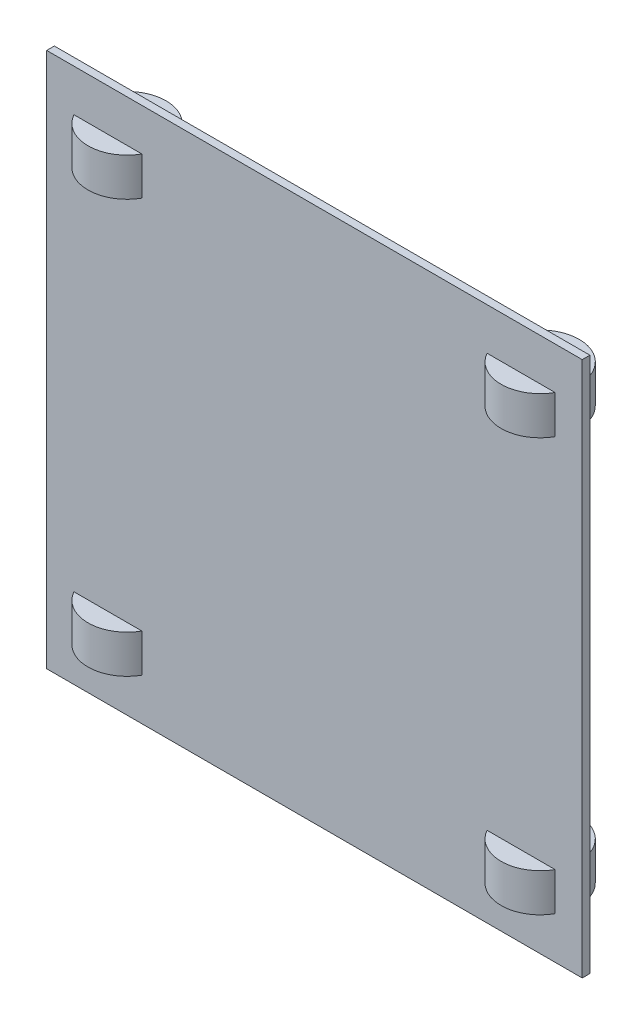
ISO-10303-21;
HEADER;
FILE_DESCRIPTION(('STEP AP214'),'2;1');
FILE_NAME('part.step','',(''),(''),'','','');
FILE_SCHEMA(('AUTOMOTIVE_DESIGN { 1 0 10303 214 1 1 1 1 }'));
ENDSEC;
DATA;
#1=APPLICATION_CONTEXT('core data for automotive mechanical design processes');
#2=APPLICATION_PROTOCOL_DEFINITION('international standard','automotive_design',2000,#1);
#3=PRODUCT_CONTEXT('',#1,'mechanical');
#4=PRODUCT('Part','Part','',(#3));
#5=PRODUCT_RELATED_PRODUCT_CATEGORY('part','',(#4));
#6=PRODUCT_DEFINITION_FORMATION('','',#4);
#7=PRODUCT_DEFINITION_CONTEXT('part definition',#1,'design');
#8=PRODUCT_DEFINITION('design','',#6,#7);
#9=PRODUCT_DEFINITION_SHAPE('','',#8);
#10=(LENGTH_UNIT() NAMED_UNIT(*) SI_UNIT(.MILLI.,.METRE.));
#11=(NAMED_UNIT(*) PLANE_ANGLE_UNIT() SI_UNIT($,.RADIAN.));
#12=(NAMED_UNIT(*) SI_UNIT($,.STERADIAN.) SOLID_ANGLE_UNIT());
#13=UNCERTAINTY_MEASURE_WITH_UNIT(LENGTH_MEASURE(1.E-05),#10,'distance_accuracy_value','');
#14=(GEOMETRIC_REPRESENTATION_CONTEXT(3) GLOBAL_UNCERTAINTY_ASSIGNED_CONTEXT((#13)) GLOBAL_UNIT_ASSIGNED_CONTEXT((#10,
#11,#12)) REPRESENTATION_CONTEXT('',''));
#15=CARTESIAN_POINT('',(0.,0.,0.));
#16=DIRECTION('',(0.,0.,1.));
#17=DIRECTION('',(1.,0.,0.));
#18=AXIS2_PLACEMENT_3D('',#15,#16,#17);
#19=CARTESIAN_POINT('',(0.,0.,10.));
#20=DIRECTION('',(0.,0.,-1.));
#21=DIRECTION('',(-1.,0.,0.));
#22=AXIS2_PLACEMENT_3D('',#19,#20,#21);
#23=PLANE('',#22);
#24=DIRECTION('',(-1.,0.,0.));
#25=VECTOR('',#24,1.);
#26=CARTESIAN_POINT('',(0.,295.,10.));
#27=LINE('',#26,#25);
#28=CARTESIAN_POINT('',(314.452221541786,295.,10.));
#29=VERTEX_POINT('',#28);
#30=CARTESIAN_POINT('',(225.547778458214,295.,10.));
#31=VERTEX_POINT('',#30);
#32=EDGE_CURVE('E220',#29,#31,#27,.T.);
#33=ORIENTED_EDGE('',*,*,#32,.F.);
#34=DIRECTION('',(0.,-1.,0.));
#35=VECTOR('',#34,1.);
#36=CARTESIAN_POINT('',(314.452221541786,295.,10.));
#37=LINE('',#36,#35);
#38=CARTESIAN_POINT('',(314.452221541786,245.,10.));
#39=VERTEX_POINT('',#38);
#40=EDGE_CURVE('E225',#39,#29,#37,.F.);
#41=ORIENTED_EDGE('',*,*,#40,.F.);
#42=DIRECTION('',(-1.,0.,0.));
#43=VECTOR('',#42,1.);
#44=CARTESIAN_POINT('',(0.,245.,10.));
#45=LINE('',#44,#43);
#46=CARTESIAN_POINT('',(225.547778458214,245.,10.));
#47=VERTEX_POINT('',#46);
#48=EDGE_CURVE('E217',#39,#47,#45,.T.);
#49=ORIENTED_EDGE('',*,*,#48,.T.);
#50=DIRECTION('',(0.,-1.,0.));
#51=VECTOR('',#50,1.);
#52=CARTESIAN_POINT('',(225.547778458214,295.,10.));
#53=LINE('',#52,#51);
#54=EDGE_CURVE('E222',#31,#47,#53,.T.);
#55=ORIENTED_EDGE('',*,*,#54,.F.);
#56=EDGE_LOOP('',(#33,#41,#49,#55));
#57=FACE_BOUND('',#56,.T.);
#58=DIRECTION('',(0.,-1.,0.));
#59=VECTOR('',#58,1.);
#60=CARTESIAN_POINT('',(-314.452221541786,295.,10.));
#61=LINE('',#60,#59);
#62=CARTESIAN_POINT('',(-314.452221541786,295.,10.));
#63=VERTEX_POINT('',#62);
#64=CARTESIAN_POINT('',(-314.452221541786,245.,10.));
#65=VERTEX_POINT('',#64);
#66=EDGE_CURVE('E240',#63,#65,#61,.T.);
#67=ORIENTED_EDGE('',*,*,#66,.F.);
#68=DIRECTION('',(1.,0.,0.));
#69=VECTOR('',#68,1.);
#70=CARTESIAN_POINT('',(0.,295.,10.));
#71=LINE('',#70,#69);
#72=CARTESIAN_POINT('',(-225.547778458214,295.,10.));
#73=VERTEX_POINT('',#72);
#74=EDGE_CURVE('E238',#63,#73,#71,.T.);
#75=ORIENTED_EDGE('',*,*,#74,.T.);
#76=DIRECTION('',(0.,-1.,0.));
#77=VECTOR('',#76,1.);
#78=CARTESIAN_POINT('',(-225.547778458214,295.,10.));
#79=LINE('',#78,#77);
#80=CARTESIAN_POINT('',(-225.547778458214,245.,10.));
#81=VERTEX_POINT('',#80);
#82=EDGE_CURVE('E243',#81,#73,#79,.F.);
#83=ORIENTED_EDGE('',*,*,#82,.F.);
#84=DIRECTION('',(1.,0.,0.));
#85=VECTOR('',#84,1.);
#86=CARTESIAN_POINT('',(0.,245.,10.));
#87=LINE('',#86,#85);
#88=EDGE_CURVE('E235',#65,#81,#87,.T.);
#89=ORIENTED_EDGE('',*,*,#88,.F.);
#90=EDGE_LOOP('',(#67,#75,#83,#89));
#91=FACE_BOUND('',#90,.T.);
#92=DIRECTION('',(0.,1.,0.));
#93=VECTOR('',#92,1.);
#94=CARTESIAN_POINT('',(350.,-350.,10.));
#95=LINE('',#94,#93);
#96=CARTESIAN_POINT('',(350.,-350.,10.));
#97=VERTEX_POINT('',#96);
#98=CARTESIAN_POINT('',(350.,350.,10.));
#99=VERTEX_POINT('',#98);
#100=EDGE_CURVE('E247',#97,#99,#95,.T.);
#101=ORIENTED_EDGE('',*,*,#100,.T.);
#102=DIRECTION('',(-1.,0.,0.));
#103=VECTOR('',#102,1.);
#104=CARTESIAN_POINT('',(-350.,350.,10.));
#105=LINE('',#104,#103);
#106=CARTESIAN_POINT('',(-350.,350.,10.));
#107=VERTEX_POINT('',#106);
#108=EDGE_CURVE('E250',#99,#107,#105,.T.);
#109=ORIENTED_EDGE('',*,*,#108,.T.);
#110=DIRECTION('',(0.,-1.,0.));
#111=VECTOR('',#110,1.);
#112=CARTESIAN_POINT('',(-350.,-350.,10.));
#113=LINE('',#112,#111);
#114=CARTESIAN_POINT('',(-350.,-350.,10.));
#115=VERTEX_POINT('',#114);
#116=EDGE_CURVE('E253',#107,#115,#113,.T.);
#117=ORIENTED_EDGE('',*,*,#116,.T.);
#118=DIRECTION('',(1.,0.,0.));
#119=VECTOR('',#118,1.);
#120=CARTESIAN_POINT('',(-350.,-350.,10.));
#121=LINE('',#120,#119);
#122=EDGE_CURVE('E255',#115,#97,#121,.T.);
#123=ORIENTED_EDGE('',*,*,#122,.T.);
#124=EDGE_LOOP('',(#101,#109,#117,#123));
#125=FACE_BOUND('',#124,.T.);
#126=DIRECTION('',(0.,1.,0.));
#127=VECTOR('',#126,1.);
#128=CARTESIAN_POINT('',(-225.547778458214,-295.,10.));
#129=LINE('',#128,#127);
#130=CARTESIAN_POINT('',(-225.547778458214,-245.,10.));
#131=VERTEX_POINT('',#130);
#132=CARTESIAN_POINT('',(-225.547778458214,-295.,10.));
#133=VERTEX_POINT('',#132);
#134=EDGE_CURVE('E205',#131,#133,#129,.F.);
#135=ORIENTED_EDGE('',*,*,#134,.T.);
#136=DIRECTION('',(-1.,0.,0.));
#137=VECTOR('',#136,1.);
#138=CARTESIAN_POINT('',(0.,-295.,10.));
#139=LINE('',#138,#137);
#140=CARTESIAN_POINT('',(-314.452221541786,-295.,10.));
#141=VERTEX_POINT('',#140);
#142=EDGE_CURVE('E203',#133,#141,#139,.T.);
#143=ORIENTED_EDGE('',*,*,#142,.T.);
#144=DIRECTION('',(0.,1.,0.));
#145=VECTOR('',#144,1.);
#146=CARTESIAN_POINT('',(-314.452221541786,-295.,10.));
#147=LINE('',#146,#145);
#148=CARTESIAN_POINT('',(-314.452221541786,-245.,10.));
#149=VERTEX_POINT('',#148);
#150=EDGE_CURVE('E207',#141,#149,#147,.T.);
#151=ORIENTED_EDGE('',*,*,#150,.T.);
#152=DIRECTION('',(-1.,0.,0.));
#153=VECTOR('',#152,1.);
#154=CARTESIAN_POINT('',(0.,-245.,10.));
#155=LINE('',#154,#153);
#156=EDGE_CURVE('E200',#131,#149,#155,.T.);
#157=ORIENTED_EDGE('',*,*,#156,.F.);
#158=EDGE_LOOP('',(#135,#143,#151,#157));
#159=FACE_BOUND('',#158,.T.);
#160=DIRECTION('',(1.,0.,0.));
#161=VECTOR('',#160,1.);
#162=CARTESIAN_POINT('',(0.,-295.,10.));
#163=LINE('',#162,#161);
#164=CARTESIAN_POINT('',(225.547778458214,-295.,10.));
#165=VERTEX_POINT('',#164);
#166=CARTESIAN_POINT('',(314.452221541786,-295.,10.));
#167=VERTEX_POINT('',#166);
#168=EDGE_CURVE('E175',#165,#167,#163,.T.);
#169=ORIENTED_EDGE('',*,*,#168,.F.);
#170=DIRECTION('',(0.,1.,0.));
#171=VECTOR('',#170,1.);
#172=CARTESIAN_POINT('',(225.547778458214,-295.,10.));
#173=LINE('',#172,#171);
#174=CARTESIAN_POINT('',(225.547778458214,-245.,10.));
#175=VERTEX_POINT('',#174);
#176=EDGE_CURVE('E181',#165,#175,#173,.T.);
#177=ORIENTED_EDGE('',*,*,#176,.T.);
#178=DIRECTION('',(1.,0.,0.));
#179=VECTOR('',#178,1.);
#180=CARTESIAN_POINT('',(0.,-245.,10.));
#181=LINE('',#180,#179);
#182=CARTESIAN_POINT('',(314.452221541786,-245.,10.));
#183=VERTEX_POINT('',#182);
#184=EDGE_CURVE('E170',#175,#183,#181,.T.);
#185=ORIENTED_EDGE('',*,*,#184,.T.);
#186=DIRECTION('',(0.,1.,0.));
#187=VECTOR('',#186,1.);
#188=CARTESIAN_POINT('',(314.452221541786,-295.,10.));
#189=LINE('',#188,#187);
#190=EDGE_CURVE('E183',#183,#167,#189,.F.);
#191=ORIENTED_EDGE('',*,*,#190,.T.);
#192=EDGE_LOOP('',(#169,#177,#185,#191));
#193=FACE_BOUND('',#192,.T.);
#194=ADVANCED_FACE('F37',(#57,#91,#125,#159,#193),#23,.F.);
#195=CARTESIAN_POINT('',(0.,0.,0.));
#196=DIRECTION('',(0.,0.,-1.));
#197=DIRECTION('',(-1.,0.,0.));
#198=AXIS2_PLACEMENT_3D('',#195,#196,#197);
#199=PLANE('',#198);
#200=DIRECTION('',(-1.,0.,0.));
#201=VECTOR('',#200,1.);
#202=CARTESIAN_POINT('',(0.,-295.,0.));
#203=LINE('',#202,#201);
#204=CARTESIAN_POINT('',(-221.255769572184,-295.,0.));
#205=VERTEX_POINT('',#204);
#206=CARTESIAN_POINT('',(-318.744230427816,-295.,0.));
#207=VERTEX_POINT('',#206);
#208=EDGE_CURVE('E304',#205,#207,#203,.T.);
#209=ORIENTED_EDGE('',*,*,#208,.F.);
#210=DIRECTION('',(0.,1.,0.));
#211=VECTOR('',#210,1.);
#212=CARTESIAN_POINT('',(-221.255769572184,-295.,0.));
#213=LINE('',#212,#211);
#214=CARTESIAN_POINT('',(-221.255769572184,-245.,0.));
#215=VERTEX_POINT('',#214);
#216=EDGE_CURVE('E299',#215,#205,#213,.F.);
#217=ORIENTED_EDGE('',*,*,#216,.F.);
#218=DIRECTION('',(-1.,0.,0.));
#219=VECTOR('',#218,1.);
#220=CARTESIAN_POINT('',(0.,-245.,0.));
#221=LINE('',#220,#219);
#222=CARTESIAN_POINT('',(-318.744230427816,-245.,0.));
#223=VERTEX_POINT('',#222);
#224=EDGE_CURVE('E296',#215,#223,#221,.T.);
#225=ORIENTED_EDGE('',*,*,#224,.T.);
#226=DIRECTION('',(0.,1.,0.));
#227=VECTOR('',#226,1.);
#228=CARTESIAN_POINT('',(-318.744230427816,-295.,0.));
#229=LINE('',#228,#227);
#230=EDGE_CURVE('E301',#207,#223,#229,.T.);
#231=ORIENTED_EDGE('',*,*,#230,.F.);
#232=EDGE_LOOP('',(#209,#217,#225,#231));
#233=FACE_BOUND('',#232,.T.);
#234=DIRECTION('',(1.,0.,0.));
#235=VECTOR('',#234,1.);
#236=CARTESIAN_POINT('',(0.,295.,0.));
#237=LINE('',#236,#235);
#238=CARTESIAN_POINT('',(-318.744230427816,295.,0.));
#239=VERTEX_POINT('',#238);
#240=CARTESIAN_POINT('',(-221.255769572184,295.,0.));
#241=VERTEX_POINT('',#240);
#242=EDGE_CURVE('E285',#239,#241,#237,.T.);
#243=ORIENTED_EDGE('',*,*,#242,.F.);
#244=DIRECTION('',(0.,-1.,0.));
#245=VECTOR('',#244,1.);
#246=CARTESIAN_POINT('',(-318.744230427816,295.,0.));
#247=LINE('',#246,#245);
#248=CARTESIAN_POINT('',(-318.744230427816,245.,0.));
#249=VERTEX_POINT('',#248);
#250=EDGE_CURVE('E279',#239,#249,#247,.T.);
#251=ORIENTED_EDGE('',*,*,#250,.T.);
#252=DIRECTION('',(1.,0.,0.));
#253=VECTOR('',#252,1.);
#254=CARTESIAN_POINT('',(0.,245.,0.));
#255=LINE('',#254,#253);
#256=CARTESIAN_POINT('',(-221.255769572184,245.,0.));
#257=VERTEX_POINT('',#256);
#258=EDGE_CURVE('E276',#249,#257,#255,.T.);
#259=ORIENTED_EDGE('',*,*,#258,.T.);
#260=DIRECTION('',(0.,-1.,0.));
#261=VECTOR('',#260,1.);
#262=CARTESIAN_POINT('',(-221.255769572184,295.,0.));
#263=LINE('',#262,#261);
#264=EDGE_CURVE('E282',#257,#241,#263,.F.);
#265=ORIENTED_EDGE('',*,*,#264,.T.);
#266=EDGE_LOOP('',(#243,#251,#259,#265));
#267=FACE_BOUND('',#266,.T.);
#268=DIRECTION('',(0.,1.,0.));
#269=VECTOR('',#268,1.);
#270=CARTESIAN_POINT('',(350.,-350.,0.));
#271=LINE('',#270,#269);
#272=CARTESIAN_POINT('',(350.,-350.,0.));
#273=VERTEX_POINT('',#272);
#274=CARTESIAN_POINT('',(350.,350.,0.));
#275=VERTEX_POINT('',#274);
#276=EDGE_CURVE('E246',#273,#275,#271,.T.);
#277=ORIENTED_EDGE('',*,*,#276,.F.);
#278=DIRECTION('',(1.,0.,0.));
#279=VECTOR('',#278,1.);
#280=CARTESIAN_POINT('',(-350.,-350.,0.));
#281=LINE('',#280,#279);
#282=CARTESIAN_POINT('',(-350.,-350.,0.));
#283=VERTEX_POINT('',#282);
#284=EDGE_CURVE('E251',#283,#273,#281,.T.);
#285=ORIENTED_EDGE('',*,*,#284,.F.);
#286=DIRECTION('',(0.,-1.,0.));
#287=VECTOR('',#286,1.);
#288=CARTESIAN_POINT('',(-350.,-350.,0.));
#289=LINE('',#288,#287);
#290=CARTESIAN_POINT('',(-350.,350.,0.));
#291=VERTEX_POINT('',#290);
#292=EDGE_CURVE('E262',#291,#283,#289,.T.);
#293=ORIENTED_EDGE('',*,*,#292,.F.);
#294=DIRECTION('',(-1.,0.,0.));
#295=VECTOR('',#294,1.);
#296=CARTESIAN_POINT('',(-350.,350.,0.));
#297=LINE('',#296,#295);
#298=EDGE_CURVE('E260',#275,#291,#297,.T.);
#299=ORIENTED_EDGE('',*,*,#298,.F.);
#300=EDGE_LOOP('',(#277,#285,#293,#299));
#301=FACE_BOUND('',#300,.T.);
#302=DIRECTION('',(0.,-1.,0.));
#303=VECTOR('',#302,1.);
#304=CARTESIAN_POINT('',(318.744230427816,295.,0.));
#305=LINE('',#304,#303);
#306=CARTESIAN_POINT('',(318.744230427816,245.,0.));
#307=VERTEX_POINT('',#306);
#308=CARTESIAN_POINT('',(318.744230427816,295.,0.));
#309=VERTEX_POINT('',#308);
#310=EDGE_CURVE('E292',#307,#309,#305,.F.);
#311=ORIENTED_EDGE('',*,*,#310,.T.);
#312=DIRECTION('',(-1.,0.,0.));
#313=VECTOR('',#312,1.);
#314=CARTESIAN_POINT('',(0.,295.,0.));
#315=LINE('',#314,#313);
#316=CARTESIAN_POINT('',(221.255769572184,295.,0.));
#317=VERTEX_POINT('',#316);
#318=EDGE_CURVE('E294',#309,#317,#315,.T.);
#319=ORIENTED_EDGE('',*,*,#318,.T.);
#320=DIRECTION('',(0.,-1.,0.));
#321=VECTOR('',#320,1.);
#322=CARTESIAN_POINT('',(221.255769572184,295.,0.));
#323=LINE('',#322,#321);
#324=CARTESIAN_POINT('',(221.255769572184,245.,0.));
#325=VERTEX_POINT('',#324);
#326=EDGE_CURVE('E290',#317,#325,#323,.T.);
#327=ORIENTED_EDGE('',*,*,#326,.T.);
#328=DIRECTION('',(-1.,0.,0.));
#329=VECTOR('',#328,1.);
#330=CARTESIAN_POINT('',(0.,245.,0.));
#331=LINE('',#330,#329);
#332=EDGE_CURVE('E287',#307,#325,#331,.T.);
#333=ORIENTED_EDGE('',*,*,#332,.F.);
#334=EDGE_LOOP('',(#311,#319,#327,#333));
#335=FACE_BOUND('',#334,.T.);
#336=DIRECTION('',(0.,1.,0.));
#337=VECTOR('',#336,1.);
#338=CARTESIAN_POINT('',(221.255769572184,-295.,0.));
#339=LINE('',#338,#337);
#340=CARTESIAN_POINT('',(221.255769572184,-295.,0.));
#341=VERTEX_POINT('',#340);
#342=CARTESIAN_POINT('',(221.255769572184,-245.,0.));
#343=VERTEX_POINT('',#342);
#344=EDGE_CURVE('E45',#341,#343,#339,.T.);
#345=ORIENTED_EDGE('',*,*,#344,.F.);
#346=DIRECTION('',(1.,0.,0.));
#347=VECTOR('',#346,1.);
#348=CARTESIAN_POINT('',(0.,-295.,0.));
#349=LINE('',#348,#347);
#350=CARTESIAN_POINT('',(318.744230427816,-295.,0.));
#351=VERTEX_POINT('',#350);
#352=EDGE_CURVE('E11',#341,#351,#349,.T.);
#353=ORIENTED_EDGE('',*,*,#352,.T.);
#354=DIRECTION('',(0.,1.,0.));
#355=VECTOR('',#354,1.);
#356=CARTESIAN_POINT('',(318.744230427816,-295.,0.));
#357=LINE('',#356,#355);
#358=CARTESIAN_POINT('',(318.744230427816,-245.,0.));
#359=VERTEX_POINT('',#358);
#360=EDGE_CURVE('E309',#359,#351,#357,.F.);
#361=ORIENTED_EDGE('',*,*,#360,.F.);
#362=DIRECTION('',(1.,0.,0.));
#363=VECTOR('',#362,1.);
#364=CARTESIAN_POINT('',(0.,-245.,0.));
#365=LINE('',#364,#363);
#366=EDGE_CURVE('E306',#343,#359,#365,.T.);
#367=ORIENTED_EDGE('',*,*,#366,.F.);
#368=EDGE_LOOP('',(#345,#353,#361,#367));
#369=FACE_BOUND('',#368,.T.);
#370=ADVANCED_FACE('F334',(#233,#267,#301,#335,#369),#199,.T.);
#371=CARTESIAN_POINT('',(350.,-350.,10.));
#372=DIRECTION('',(-1.,0.,0.));
#373=DIRECTION('',(0.,0.,1.));
#374=AXIS2_PLACEMENT_3D('',#371,#372,#373);
#375=PLANE('',#374);
#376=ORIENTED_EDGE('',*,*,#276,.T.);
#377=DIRECTION('',(0.,0.,-1.));
#378=VECTOR('',#377,1.);
#379=CARTESIAN_POINT('',(350.,350.,10.));
#380=LINE('',#379,#378);
#381=EDGE_CURVE('E273',#99,#275,#380,.T.);
#382=ORIENTED_EDGE('',*,*,#381,.F.);
#383=ORIENTED_EDGE('',*,*,#100,.F.);
#384=DIRECTION('',(0.,0.,-1.));
#385=VECTOR('',#384,1.);
#386=CARTESIAN_POINT('',(350.,-350.,10.));
#387=LINE('',#386,#385);
#388=EDGE_CURVE('E257',#97,#273,#387,.T.);
#389=ORIENTED_EDGE('',*,*,#388,.T.);
#390=EDGE_LOOP('',(#376,#382,#383,#389));
#391=FACE_BOUND('',#390,.T.);
#392=ADVANCED_FACE('F39',(#391),#375,.F.);
#393=CARTESIAN_POINT('',(-350.,350.,10.));
#394=DIRECTION('',(0.,-1.,0.));
#395=DIRECTION('',(0.,0.,-1.));
#396=AXIS2_PLACEMENT_3D('',#393,#394,#395);
#397=PLANE('',#396);
#398=ORIENTED_EDGE('',*,*,#298,.T.);
#399=DIRECTION('',(0.,0.,-1.));
#400=VECTOR('',#399,1.);
#401=CARTESIAN_POINT('',(-350.,350.,10.));
#402=LINE('',#401,#400);
#403=EDGE_CURVE('E270',#107,#291,#402,.T.);
#404=ORIENTED_EDGE('',*,*,#403,.F.);
#405=ORIENTED_EDGE('',*,*,#108,.F.);
#406=ORIENTED_EDGE('',*,*,#381,.T.);
#407=EDGE_LOOP('',(#398,#404,#405,#406));
#408=FACE_BOUND('',#407,.T.);
#409=ADVANCED_FACE('F355',(#408),#397,.F.);
#410=CARTESIAN_POINT('',(-350.,-350.,10.));
#411=DIRECTION('',(1.,0.,0.));
#412=DIRECTION('',(0.,0.,-1.));
#413=AXIS2_PLACEMENT_3D('',#410,#411,#412);
#414=PLANE('',#413);
#415=ORIENTED_EDGE('',*,*,#292,.T.);
#416=DIRECTION('',(0.,0.,-1.));
#417=VECTOR('',#416,1.);
#418=CARTESIAN_POINT('',(-350.,-350.,10.));
#419=LINE('',#418,#417);
#420=EDGE_CURVE('E267',#115,#283,#419,.T.);
#421=ORIENTED_EDGE('',*,*,#420,.F.);
#422=ORIENTED_EDGE('',*,*,#116,.F.);
#423=ORIENTED_EDGE('',*,*,#403,.T.);
#424=EDGE_LOOP('',(#415,#421,#422,#423));
#425=FACE_BOUND('',#424,.T.);
#426=ADVANCED_FACE('F352',(#425),#414,.F.);
#427=CARTESIAN_POINT('',(-350.,-350.,10.));
#428=DIRECTION('',(0.,1.,0.));
#429=DIRECTION('',(0.,0.,1.));
#430=AXIS2_PLACEMENT_3D('',#427,#428,#429);
#431=PLANE('',#430);
#432=ORIENTED_EDGE('',*,*,#284,.T.);
#433=ORIENTED_EDGE('',*,*,#388,.F.);
#434=ORIENTED_EDGE('',*,*,#122,.F.);
#435=ORIENTED_EDGE('',*,*,#420,.T.);
#436=EDGE_LOOP('',(#432,#433,#434,#435));
#437=FACE_BOUND('',#436,.T.);
#438=ADVANCED_FACE('F348',(#437),#431,.F.);
#439=CARTESIAN_POINT('',(-270.,295.,-15.));
#440=DIRECTION('',(0.,1.,0.));
#441=DIRECTION('',(0.,0.,1.));
#442=AXIS2_PLACEMENT_3D('',#439,#440,#441);
#443=PLANE('',#442);
#444=CARTESIAN_POINT('',(-270.,295.,-15.));
#445=DIRECTION('',(0.,1.,0.));
#446=DIRECTION('',(0.,0.,1.));
#447=AXIS2_PLACEMENT_3D('',#444,#445,#446);
#448=CIRCLE('',#447,51.);
#449=EDGE_CURVE('E231',#241,#239,#448,.T.);
#450=ORIENTED_EDGE('',*,*,#449,.T.);
#451=ORIENTED_EDGE('',*,*,#242,.T.);
#452=EDGE_LOOP('',(#450,#451));
#453=FACE_BOUND('',#452,.T.);
#454=ADVANCED_FACE('F351',(#453),#443,.T.);
#455=CARTESIAN_POINT('',(-270.,245.,-15.));
#456=DIRECTION('',(0.,1.,0.));
#457=DIRECTION('',(0.,0.,1.));
#458=AXIS2_PLACEMENT_3D('',#455,#456,#457);
#459=PLANE('',#458);
#460=ORIENTED_EDGE('',*,*,#258,.F.);
#461=CARTESIAN_POINT('',(-270.,245.,-15.));
#462=DIRECTION('',(0.,1.,0.));
#463=DIRECTION('',(0.,0.,1.));
#464=AXIS2_PLACEMENT_3D('',#461,#462,#463);
#465=CIRCLE('',#464,51.);
#466=EDGE_CURVE('E232',#257,#249,#465,.T.);
#467=ORIENTED_EDGE('',*,*,#466,.F.);
#468=EDGE_LOOP('',(#460,#467));
#469=FACE_BOUND('',#468,.T.);
#470=ADVANCED_FACE('F427',(#469),#459,.F.);
#471=CARTESIAN_POINT('',(-270.,295.,-15.));
#472=DIRECTION('',(0.,-1.,0.));
#473=DIRECTION('',(0.,0.,-1.));
#474=AXIS2_PLACEMENT_3D('',#471,#472,#473);
#475=CYLINDRICAL_SURFACE('',#474,51.);
#476=ORIENTED_EDGE('',*,*,#264,.F.);
#477=ORIENTED_EDGE('',*,*,#466,.T.);
#478=ORIENTED_EDGE('',*,*,#250,.F.);
#479=ORIENTED_EDGE('',*,*,#449,.F.);
#480=EDGE_LOOP('',(#476,#477,#478,#479));
#481=FACE_BOUND('',#480,.T.);
#482=ADVANCED_FACE('F345',(#481),#475,.T.);
#483=EDGE_CURVE('E227',#65,#81,#465,.T.);
#484=ORIENTED_EDGE('',*,*,#483,.T.);
#485=ORIENTED_EDGE('',*,*,#82,.T.);
#486=EDGE_CURVE('E228',#63,#73,#448,.T.);
#487=ORIENTED_EDGE('',*,*,#486,.F.);
#488=ORIENTED_EDGE('',*,*,#66,.T.);
#489=EDGE_LOOP('',(#484,#485,#487,#488));
#490=FACE_BOUND('',#489,.T.);
#491=ADVANCED_FACE('F434',(#490),#475,.T.);
#492=ORIENTED_EDGE('',*,*,#74,.F.);
#493=ORIENTED_EDGE('',*,*,#486,.T.);
#494=EDGE_LOOP('',(#492,#493));
#495=FACE_BOUND('',#494,.T.);
#496=ADVANCED_FACE('F436',(#495),#443,.T.);
#497=ORIENTED_EDGE('',*,*,#483,.F.);
#498=ORIENTED_EDGE('',*,*,#88,.T.);
#499=EDGE_LOOP('',(#497,#498));
#500=FACE_BOUND('',#499,.T.);
#501=ADVANCED_FACE('F429',(#500),#459,.F.);
#502=CARTESIAN_POINT('',(270.,295.,-15.0000000000001));
#503=DIRECTION('',(0.,-1.,0.));
#504=DIRECTION('',(0.,0.,-1.));
#505=AXIS2_PLACEMENT_3D('',#502,#503,#504);
#506=PLANE('',#505);
#507=ORIENTED_EDGE('',*,*,#318,.F.);
#508=CARTESIAN_POINT('',(270.,295.,-15.0000000000001));
#509=DIRECTION('',(0.,1.,0.));
#510=DIRECTION('',(0.,0.,-1.));
#511=AXIS2_PLACEMENT_3D('',#508,#509,#510);
#512=CIRCLE('',#511,51.);
#513=EDGE_CURVE('E209',#309,#317,#512,.T.);
#514=ORIENTED_EDGE('',*,*,#513,.T.);
#515=EDGE_LOOP('',(#507,#514));
#516=FACE_BOUND('',#515,.T.);
#517=ADVANCED_FACE('F438',(#516),#506,.F.);
#518=CARTESIAN_POINT('',(270.,245.,-15.0000000000001));
#519=DIRECTION('',(0.,-1.,0.));
#520=DIRECTION('',(0.,0.,-1.));
#521=AXIS2_PLACEMENT_3D('',#518,#519,#520);
#522=PLANE('',#521);
#523=CARTESIAN_POINT('',(270.,245.,-15.0000000000001));
#524=DIRECTION('',(0.,1.,0.));
#525=DIRECTION('',(0.,0.,-1.));
#526=AXIS2_PLACEMENT_3D('',#523,#524,#525);
#527=CIRCLE('',#526,51.);
#528=EDGE_CURVE('E210',#307,#325,#527,.T.);
#529=ORIENTED_EDGE('',*,*,#528,.F.);
#530=ORIENTED_EDGE('',*,*,#332,.T.);
#531=EDGE_LOOP('',(#529,#530));
#532=FACE_BOUND('',#531,.T.);
#533=ADVANCED_FACE('F410',(#532),#522,.T.);
#534=CARTESIAN_POINT('',(270.,295.,-15.0000000000001));
#535=DIRECTION('',(0.,-1.,0.));
#536=DIRECTION('',(0.,0.,-1.));
#537=AXIS2_PLACEMENT_3D('',#534,#535,#536);
#538=CYLINDRICAL_SURFACE('',#537,51.);
#539=ORIENTED_EDGE('',*,*,#310,.F.);
#540=ORIENTED_EDGE('',*,*,#528,.T.);
#541=ORIENTED_EDGE('',*,*,#326,.F.);
#542=ORIENTED_EDGE('',*,*,#513,.F.);
#543=EDGE_LOOP('',(#539,#540,#541,#542));
#544=FACE_BOUND('',#543,.T.);
#545=ADVANCED_FACE('F482',(#544),#538,.T.);
#546=EDGE_CURVE('E213',#47,#39,#527,.T.);
#547=ORIENTED_EDGE('',*,*,#546,.T.);
#548=ORIENTED_EDGE('',*,*,#40,.T.);
#549=EDGE_CURVE('E214',#31,#29,#512,.T.);
#550=ORIENTED_EDGE('',*,*,#549,.F.);
#551=ORIENTED_EDGE('',*,*,#54,.T.);
#552=EDGE_LOOP('',(#547,#548,#550,#551));
#553=FACE_BOUND('',#552,.T.);
#554=ADVANCED_FACE('F492',(#553),#538,.T.);
#555=ORIENTED_EDGE('',*,*,#549,.T.);
#556=ORIENTED_EDGE('',*,*,#32,.T.);
#557=EDGE_LOOP('',(#555,#556));
#558=FACE_BOUND('',#557,.T.);
#559=ADVANCED_FACE('F407',(#558),#506,.F.);
#560=ORIENTED_EDGE('',*,*,#48,.F.);
#561=ORIENTED_EDGE('',*,*,#546,.F.);
#562=EDGE_LOOP('',(#560,#561));
#563=FACE_BOUND('',#562,.T.);
#564=ADVANCED_FACE('F399',(#563),#522,.T.);
#565=CARTESIAN_POINT('',(-270.,-245.,-15.));
#566=DIRECTION('',(0.,-1.,0.));
#567=DIRECTION('',(0.,0.,1.));
#568=AXIS2_PLACEMENT_3D('',#565,#566,#567);
#569=PLANE('',#568);
#570=ORIENTED_EDGE('',*,*,#224,.F.);
#571=CARTESIAN_POINT('',(-270.,-245.,-15.));
#572=DIRECTION('',(0.,1.,0.));
#573=DIRECTION('',(0.,0.,1.));
#574=AXIS2_PLACEMENT_3D('',#571,#572,#573);
#575=CIRCLE('',#574,51.);
#576=EDGE_CURVE('E191',#215,#223,#575,.T.);
#577=ORIENTED_EDGE('',*,*,#576,.T.);
#578=EDGE_LOOP('',(#570,#577));
#579=FACE_BOUND('',#578,.T.);
#580=ADVANCED_FACE('F390',(#579),#569,.F.);
#581=CARTESIAN_POINT('',(-270.,-295.,-15.));
#582=DIRECTION('',(0.,-1.,0.));
#583=DIRECTION('',(0.,0.,1.));
#584=AXIS2_PLACEMENT_3D('',#581,#582,#583);
#585=PLANE('',#584);
#586=CARTESIAN_POINT('',(-270.,-295.,-15.));
#587=DIRECTION('',(0.,1.,0.));
#588=DIRECTION('',(0.,0.,1.));
#589=AXIS2_PLACEMENT_3D('',#586,#587,#588);
#590=CIRCLE('',#589,51.);
#591=EDGE_CURVE('E198',#205,#207,#590,.T.);
#592=ORIENTED_EDGE('',*,*,#591,.F.);
#593=ORIENTED_EDGE('',*,*,#208,.T.);
#594=EDGE_LOOP('',(#592,#593));
#595=FACE_BOUND('',#594,.T.);
#596=ADVANCED_FACE('F396',(#595),#585,.T.);
#597=CARTESIAN_POINT('',(-270.,-295.,-15.));
#598=DIRECTION('',(0.,1.,0.));
#599=DIRECTION('',(0.,0.,1.));
#600=AXIS2_PLACEMENT_3D('',#597,#598,#599);
#601=CYLINDRICAL_SURFACE('',#600,51.);
#602=ORIENTED_EDGE('',*,*,#591,.T.);
#603=ORIENTED_EDGE('',*,*,#230,.T.);
#604=ORIENTED_EDGE('',*,*,#576,.F.);
#605=ORIENTED_EDGE('',*,*,#216,.T.);
#606=EDGE_LOOP('',(#602,#603,#604,#605));
#607=FACE_BOUND('',#606,.T.);
#608=ADVANCED_FACE('F405',(#607),#601,.T.);
#609=ORIENTED_EDGE('',*,*,#150,.F.);
#610=EDGE_CURVE('E196',#141,#133,#590,.T.);
#611=ORIENTED_EDGE('',*,*,#610,.T.);
#612=ORIENTED_EDGE('',*,*,#134,.F.);
#613=EDGE_CURVE('E188',#149,#131,#575,.T.);
#614=ORIENTED_EDGE('',*,*,#613,.F.);
#615=EDGE_LOOP('',(#609,#611,#612,#614));
#616=FACE_BOUND('',#615,.T.);
#617=ADVANCED_FACE('F385',(#616),#601,.T.);
#618=ORIENTED_EDGE('',*,*,#142,.F.);
#619=ORIENTED_EDGE('',*,*,#610,.F.);
#620=EDGE_LOOP('',(#618,#619));
#621=FACE_BOUND('',#620,.T.);
#622=ADVANCED_FACE('F384',(#621),#585,.T.);
#623=ORIENTED_EDGE('',*,*,#613,.T.);
#624=ORIENTED_EDGE('',*,*,#156,.T.);
#625=EDGE_LOOP('',(#623,#624));
#626=FACE_BOUND('',#625,.T.);
#627=ADVANCED_FACE('F387',(#626),#569,.F.);
#628=CARTESIAN_POINT('',(270.,-245.,-15.0000000000001));
#629=DIRECTION('',(0.,1.,0.));
#630=DIRECTION('',(0.,0.,-1.));
#631=AXIS2_PLACEMENT_3D('',#628,#629,#630);
#632=PLANE('',#631);
#633=CARTESIAN_POINT('',(270.,-245.,-15.0000000000001));
#634=DIRECTION('',(0.,1.,0.));
#635=DIRECTION('',(0.,0.,-1.));
#636=AXIS2_PLACEMENT_3D('',#633,#634,#635);
#637=CIRCLE('',#636,51.);
#638=EDGE_CURVE('E185',#359,#343,#637,.T.);
#639=ORIENTED_EDGE('',*,*,#638,.T.);
#640=ORIENTED_EDGE('',*,*,#366,.T.);
#641=EDGE_LOOP('',(#639,#640));
#642=FACE_BOUND('',#641,.T.);
#643=ADVANCED_FACE('F318',(#642),#632,.T.);
#644=CARTESIAN_POINT('',(270.,-295.,-15.0000000000001));
#645=DIRECTION('',(0.,1.,0.));
#646=DIRECTION('',(0.,0.,-1.));
#647=AXIS2_PLACEMENT_3D('',#644,#645,#646);
#648=PLANE('',#647);
#649=ORIENTED_EDGE('',*,*,#352,.F.);
#650=CARTESIAN_POINT('',(270.,-295.,-15.0000000000001));
#651=DIRECTION('',(0.,1.,0.));
#652=DIRECTION('',(0.,0.,-1.));
#653=AXIS2_PLACEMENT_3D('',#650,#651,#652);
#654=CIRCLE('',#653,51.);
#655=EDGE_CURVE('E184',#351,#341,#654,.T.);
#656=ORIENTED_EDGE('',*,*,#655,.F.);
#657=EDGE_LOOP('',(#649,#656));
#658=FACE_BOUND('',#657,.T.);
#659=ADVANCED_FACE('F324',(#658),#648,.F.);
#660=CARTESIAN_POINT('',(270.,-295.,-15.0000000000001));
#661=DIRECTION('',(0.,1.,0.));
#662=DIRECTION('',(0.,0.,1.));
#663=AXIS2_PLACEMENT_3D('',#660,#661,#662);
#664=CYLINDRICAL_SURFACE('',#663,51.);
#665=ORIENTED_EDGE('',*,*,#655,.T.);
#666=ORIENTED_EDGE('',*,*,#344,.T.);
#667=ORIENTED_EDGE('',*,*,#638,.F.);
#668=ORIENTED_EDGE('',*,*,#360,.T.);
#669=EDGE_LOOP('',(#665,#666,#667,#668));
#670=FACE_BOUND('',#669,.T.);
#671=ADVANCED_FACE('F315',(#670),#664,.T.);
#672=ORIENTED_EDGE('',*,*,#176,.F.);
#673=EDGE_CURVE('E176',#165,#167,#654,.T.);
#674=ORIENTED_EDGE('',*,*,#673,.T.);
#675=ORIENTED_EDGE('',*,*,#190,.F.);
#676=EDGE_CURVE('E51',#175,#183,#637,.T.);
#677=ORIENTED_EDGE('',*,*,#676,.F.);
#678=EDGE_LOOP('',(#672,#674,#675,#677));
#679=FACE_BOUND('',#678,.T.);
#680=ADVANCED_FACE('F179',(#679),#664,.T.);
#681=ORIENTED_EDGE('',*,*,#673,.F.);
#682=ORIENTED_EDGE('',*,*,#168,.T.);
#683=EDGE_LOOP('',(#681,#682));
#684=FACE_BOUND('',#683,.T.);
#685=ADVANCED_FACE('F321',(#684),#648,.F.);
#686=ORIENTED_EDGE('',*,*,#184,.F.);
#687=ORIENTED_EDGE('',*,*,#676,.T.);
#688=EDGE_LOOP('',(#686,#687));
#689=FACE_BOUND('',#688,.T.);
#690=ADVANCED_FACE('F171',(#689),#632,.T.);
#691=CLOSED_SHELL('',(#194,#370,#392,#409,#426,#438,#454,#470,#482,#491,#496,#501,#517,#533,
#545,#554,#559,#564,#580,#596,#608,#617,#622,#627,#643,#659,#671,#680,#685,#690));
#692=MANIFOLD_SOLID_BREP('B2',#691);
#693=ADVANCED_BREP_SHAPE_REPRESENTATION('',(#18,#692),#14);
#694=SHAPE_DEFINITION_REPRESENTATION(#9,#693);
ENDSEC;
END-ISO-10303-21;
